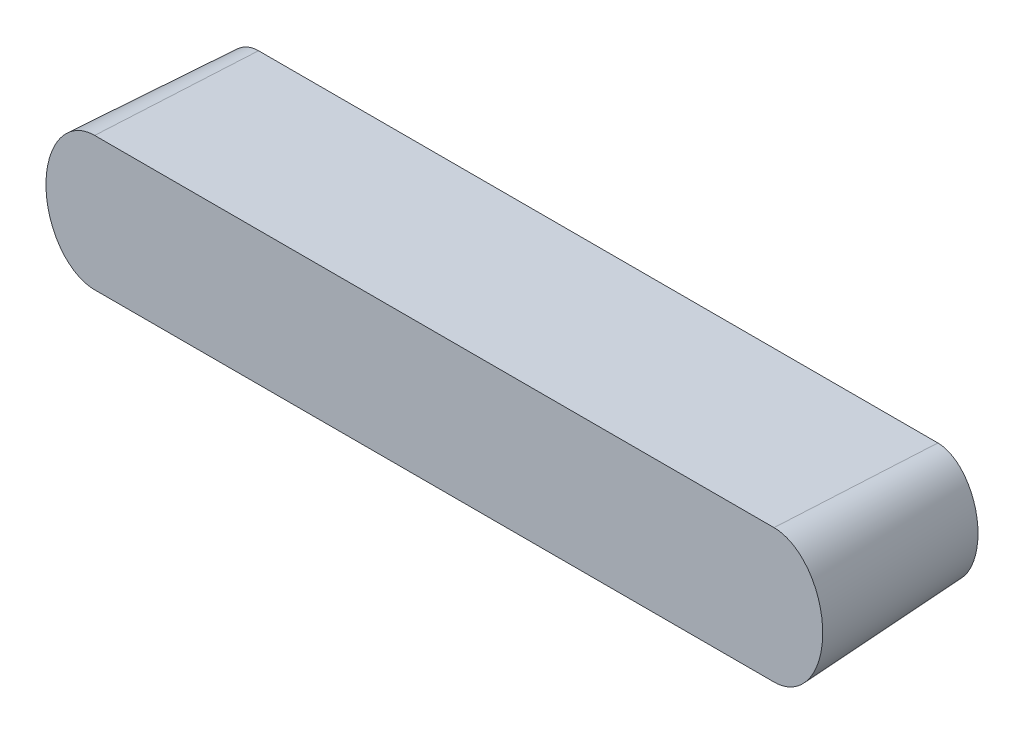
ISO-10303-21;
HEADER;
FILE_DESCRIPTION(('STEP AP214'),'2;1');
FILE_NAME('part.step','',(''),(''),'','','');
FILE_SCHEMA(('AUTOMOTIVE_DESIGN { 1 0 10303 214 1 1 1 1 }'));
ENDSEC;
DATA;
#1=APPLICATION_CONTEXT('core data for automotive mechanical design processes');
#2=APPLICATION_PROTOCOL_DEFINITION('international standard','automotive_design',2000,#1);
#3=PRODUCT_CONTEXT('',#1,'mechanical');
#4=PRODUCT('Part','Part','',(#3));
#5=PRODUCT_RELATED_PRODUCT_CATEGORY('part','',(#4));
#6=PRODUCT_DEFINITION_FORMATION('','',#4);
#7=PRODUCT_DEFINITION_CONTEXT('part definition',#1,'design');
#8=PRODUCT_DEFINITION('design','',#6,#7);
#9=PRODUCT_DEFINITION_SHAPE('','',#8);
#10=(LENGTH_UNIT() NAMED_UNIT(*) SI_UNIT(.MILLI.,.METRE.));
#11=(NAMED_UNIT(*) PLANE_ANGLE_UNIT() SI_UNIT($,.RADIAN.));
#12=(NAMED_UNIT(*) SI_UNIT($,.STERADIAN.) SOLID_ANGLE_UNIT());
#13=UNCERTAINTY_MEASURE_WITH_UNIT(LENGTH_MEASURE(1.E-05),#10,'distance_accuracy_value','');
#14=(GEOMETRIC_REPRESENTATION_CONTEXT(3) GLOBAL_UNCERTAINTY_ASSIGNED_CONTEXT((#13)) GLOBAL_UNIT_ASSIGNED_CONTEXT((#10,
#11,#12)) REPRESENTATION_CONTEXT('',''));
#15=CARTESIAN_POINT('',(0.,0.,0.));
#16=DIRECTION('',(0.,0.,1.));
#17=DIRECTION('',(1.,0.,0.));
#18=AXIS2_PLACEMENT_3D('',#15,#16,#17);
#19=CARTESIAN_POINT('',(0.,-15.1,0.));
#20=DIRECTION('',(0.,-0.998629534754574,-0.0523359562429439));
#21=DIRECTION('',(0.,0.0523359562429439,-0.998629534754574));
#22=AXIS2_PLACEMENT_3D('',#19,#20,#21);
#23=PLANE('',#22);
#24=DIRECTION('',(-1.,0.,0.));
#25=VECTOR('',#24,1.);
#26=CARTESIAN_POINT('',(0.,-15.1,0.));
#27=LINE('',#26,#25);
#28=CARTESIAN_POINT('',(76.7,-15.1,0.));
#29=VERTEX_POINT('',#28);
#30=CARTESIAN_POINT('',(-76.7,-15.1,0.));
#31=VERTEX_POINT('',#30);
#32=EDGE_CURVE('E106',#29,#31,#27,.T.);
#33=ORIENTED_EDGE('',*,*,#32,.T.);
#34=DIRECTION('',(-1.36167843581694E-13,-0.0523359562429439,0.998629534754574));
#35=VECTOR('',#34,1.);
#36=CARTESIAN_POINT('',(-76.7,-15.1,0.));
#37=LINE('',#36,#35);
#38=CARTESIAN_POINT('',(-76.6999999999949,-13.1609121665274,-37.));
#39=VERTEX_POINT('',#38);
#40=EDGE_CURVE('E11',#39,#31,#37,.T.);
#41=ORIENTED_EDGE('',*,*,#40,.F.);
#42=DIRECTION('',(1.,0.,0.));
#43=VECTOR('',#42,1.);
#44=CARTESIAN_POINT('',(0.,-13.1609121665275,-37.));
#45=LINE('',#44,#43);
#46=CARTESIAN_POINT('',(76.7,-13.1609121665275,-37.));
#47=VERTEX_POINT('',#46);
#48=EDGE_CURVE('E72',#47,#39,#45,.F.);
#49=ORIENTED_EDGE('',*,*,#48,.F.);
#50=DIRECTION('',(0.,-0.0523359562429439,0.998629534754574));
#51=VECTOR('',#50,1.);
#52=CARTESIAN_POINT('',(76.7,-15.1,0.));
#53=LINE('',#52,#51);
#54=EDGE_CURVE('E92',#47,#29,#53,.T.);
#55=ORIENTED_EDGE('',*,*,#54,.T.);
#56=EDGE_LOOP('',(#33,#41,#49,#55));
#57=FACE_BOUND('',#56,.T.);
#58=ADVANCED_FACE('F47',(#57),#23,.T.);
#59=CARTESIAN_POINT('',(-76.7,15.1,0.));
#60=CARTESIAN_POINT('',(-78.1401562411172,15.0999999999962,0.));
#61=CARTESIAN_POINT('',(-79.5792267295767,14.7069874167698,0.));
#62=CARTESIAN_POINT('',(-82.2398087824553,13.194174465071,0.));
#63=CARTESIAN_POINT('',(-83.4600139206978,12.0749693188768,0.));
#64=CARTESIAN_POINT('',(-85.4963352654062,9.2796554729569,0.));
#65=CARTESIAN_POINT('',(-86.3116502723299,7.60464660216702,0.));
#66=CARTESIAN_POINT('',(-87.4136994429184,3.95239305525867,0.));
#67=CARTESIAN_POINT('',(-87.7,1.97658537643877,0.));
#68=CARTESIAN_POINT('',(-87.7,-1.97658537643876,0.));
#69=CARTESIAN_POINT('',(-87.4136994429317,-3.95239305525785,0.));
#70=CARTESIAN_POINT('',(-86.3116502723166,-7.60464660216785,0.));
#71=CARTESIAN_POINT('',(-85.4963352654062,-9.2796554729554,0.));
#72=CARTESIAN_POINT('',(-83.4600139206978,-12.0749693188783,0.));
#73=CARTESIAN_POINT('',(-82.239808782457,-13.1941744650714,0.));
#74=CARTESIAN_POINT('',(-79.579226729575,-14.7069874167694,0.));
#75=CARTESIAN_POINT('',(-78.1401562411185,-15.0999999999962,0.));
#76=CARTESIAN_POINT('',(-76.7,-15.1,0.));
#77=CARTESIAN_POINT('',(-76.7,12.773094599833,-44.4));
#78=CARTESIAN_POINT('',(-77.7186303323347,12.7730945998255,-44.4));
#79=CARTESIAN_POINT('',(-78.7508657085418,12.5012362949952,-44.4));
#80=CARTESIAN_POINT('',(-80.7678578028915,11.3543700421512,-44.4));
#81=CARTESIAN_POINT('',(-81.7499469746874,10.4705336706187,-44.4));
#82=CARTESIAN_POINT('',(-83.4448531115476,8.14388979018459,-44.4));
#83=CARTESIAN_POINT('',(-84.1527814994153,6.70434447779965,-44.4));
#84=CARTESIAN_POINT('',(-85.1171714026316,3.50830156084452,-44.4));
#85=CARTESIAN_POINT('',(-85.373094599833,1.75469774387151,-44.4));
#86=CARTESIAN_POINT('',(-85.373094599833,-1.7546977438715,-44.4));
#87=CARTESIAN_POINT('',(-85.1171714026448,-3.5083015608437,-44.4));
#88=CARTESIAN_POINT('',(-84.152781499402,-6.70434447780048,-44.4));
#89=CARTESIAN_POINT('',(-83.4448531115476,-8.14388979018308,-44.4));
#90=CARTESIAN_POINT('',(-81.7499469746874,-10.4705336706202,-44.4));
#91=CARTESIAN_POINT('',(-80.7678578028822,-11.3543700421518,-44.4));
#92=CARTESIAN_POINT('',(-78.7508657085511,-12.5012362949946,-44.4));
#93=CARTESIAN_POINT('',(-77.7186303323277,-12.7730945998255,-44.4));
#94=CARTESIAN_POINT('',(-76.7,-12.7730945998329,-44.4));
#95=B_SPLINE_SURFACE_WITH_KNOTS('',1,3,((#59,#60,#61,#62,#63,#64,#65,#66,#67,#68,#69,#70,#71,
#72,#73,#74,#75,#76),(#77,#78,#79,#80,#81,#82,#83,#84,#85,#86,#87,#88,#89,#90,#91,#92,#93,#94)),
.UNSPECIFIED.,.F.,.F.,.F.,(2,2),(4,2,2,2,2,2,2,2,4),(0.,1.),(0.,0.392699081698724,
0.785398163397448,1.17809724509617,1.5707963267949,1.96349540849362,2.35619449019234,
2.74889357189107,3.14159265358979),.UNSPECIFIED.);
#96=CARTESIAN_POINT('',(-76.7,15.1,0.));
#97=CARTESIAN_POINT('',(-76.8392444738131,15.1000024307595,0.));
#98=CARTESIAN_POINT('',(-76.9784607489228,15.0963248963539,0.));
#99=CARTESIAN_POINT('',(-77.2564980105823,15.0816977278739,0.));
#100=CARTESIAN_POINT('',(-77.3953190336352,15.0707487887659,0.));
#101=CARTESIAN_POINT('',(-77.8103875266034,15.027160531762,0.));
#102=CARTESIAN_POINT('',(-78.0855772376846,14.9837793380328,0.));
#103=CARTESIAN_POINT('',(-78.6273363493884,14.8701992715203,0.));
#104=CARTESIAN_POINT('',(-78.893965091248,14.8002788658976,0.));
#105=CARTESIAN_POINT('',(-79.4192943901191,14.6351764138245,0.));
#106=CARTESIAN_POINT('',(-79.6779943955578,14.5399926143234,0.));
#107=CARTESIAN_POINT('',(-80.1462703289712,14.342746800664,0.));
#108=CARTESIAN_POINT('',(-80.3572615282197,14.244018548094,0.));
#109=CARTESIAN_POINT('',(-80.7711452931723,14.0310324420212,0.));
#110=CARTESIAN_POINT('',(-80.9740395721764,13.9167778966483,0.));
#111=CARTESIAN_POINT('',(-81.5703289949608,13.5522511000801,0.));
#112=CARTESIAN_POINT('',(-81.9507820794239,13.2804515711089,0.));
#113=CARTESIAN_POINT('',(-82.5815763140169,12.7663863786033,0.));
#114=CARTESIAN_POINT('',(-82.8403766648996,12.5342298258933,0.));
#115=CARTESIAN_POINT('',(-83.3368503589051,12.0481529505582,0.));
#116=CARTESIAN_POINT('',(-83.5745170290508,11.79422580321,0.));
#117=CARTESIAN_POINT('',(-84.0288213505259,11.2675290066093,0.));
#118=CARTESIAN_POINT('',(-84.2454219189834,10.9947275269127,0.));
#119=CARTESIAN_POINT('',(-84.6571641440013,10.4334420345669,0.));
#120=CARTESIAN_POINT('',(-84.8523049470044,10.1449573988051,0.));
#121=CARTESIAN_POINT('',(-85.286380499131,9.45197108258819,0.));
#122=CARTESIAN_POINT('',(-85.5168133360782,9.04213347857937,0.));
#123=CARTESIAN_POINT('',(-85.9414435954454,8.20407801193669,0.));
#124=CARTESIAN_POINT('',(-86.1356284070178,7.77585381602134,0.));
#125=CARTESIAN_POINT('',(-86.4889113076801,6.90502290006705,0.));
#126=CARTESIAN_POINT('',(-86.64799608004,6.46241079416522,0.));
#127=CARTESIAN_POINT('',(-86.9315504432145,5.56633738888973,0.));
#128=CARTESIAN_POINT('',(-87.0560234937032,5.11287717878144,0.));
#129=CARTESIAN_POINT('',(-87.2739282370787,4.18853326893497,0.));
#130=CARTESIAN_POINT('',(-87.3666528770068,3.71748366494606,0.));
#131=CARTESIAN_POINT('',(-87.5183768145787,2.77000982461171,0.));
#132=CARTESIAN_POINT('',(-87.5773751404008,2.29358543379545,0.));
#133=CARTESIAN_POINT('',(-87.6620399245951,1.33746362037962,0.));
#134=CARTESIAN_POINT('',(-87.6876868141429,0.857764442078052,0.));
#135=CARTESIAN_POINT('',(-87.7009337978687,0.137819964702817,0.));
#136=CARTESIAN_POINT('',(-87.7011443345424,-0.102251355016315,0.));
#137=CARTESIAN_POINT('',(-87.6931401009297,-0.582256733572873,0.));
#138=CARTESIAN_POINT('',(-87.6849250966077,-0.822190788412271,0.));
#139=CARTESIAN_POINT('',(-87.6429687983077,-1.63366470742784,0.));
#140=CARTESIAN_POINT('',(-87.5896324853747,-2.20431103678944,0.));
#141=CARTESIAN_POINT('',(-87.435169783736,-3.33929163993242,0.));
#142=CARTESIAN_POINT('',(-87.334031208996,-3.90362426661402,0.));
#143=CARTESIAN_POINT('',(-87.1455252233669,-4.74153456654375,0.));
#144=CARTESIAN_POINT('',(-87.0765766453844,-5.01934463684308,0.));
#145=CARTESIAN_POINT('',(-86.9260736126981,-5.57155969823485,0.));
#146=CARTESIAN_POINT('',(-86.8445189060988,-5.84596462116729,0.));
#147=CARTESIAN_POINT('',(-86.6685992676085,-6.39051431814964,0.));
#148=CARTESIAN_POINT('',(-86.5742397206635,-6.66066083001091,0.));
#149=CARTESIAN_POINT('',(-86.3725838012229,-7.1960507213937,0.));
#150=CARTESIAN_POINT('',(-86.2652885629976,-7.46129452846163,0.));
#151=CARTESIAN_POINT('',(-85.9971648822763,-8.0791288712665,0.));
#152=CARTESIAN_POINT('',(-85.8308411403944,-8.42935770764196,0.));
#153=CARTESIAN_POINT('',(-85.4734032734727,-9.11693182516354,0.));
#154=CARTESIAN_POINT('',(-85.2822908980812,-9.45427801342831,0.));
#155=CARTESIAN_POINT('',(-84.8746357492565,-10.11274898169,0.));
#156=CARTESIAN_POINT('',(-84.658124172163,-10.4338929823827,0.));
#157=CARTESIAN_POINT('',(-84.1985913214698,-11.0566206820528,0.));
#158=CARTESIAN_POINT('',(-83.9555772783707,-11.358209680472,0.));
#159=CARTESIAN_POINT('',(-83.5029065262132,-11.87027874714,0.));
#160=CARTESIAN_POINT('',(-83.2987041712001,-12.0855933991682,0.));
#161=CARTESIAN_POINT('',(-82.8747884134033,-12.5004447714639,0.));
#162=CARTESIAN_POINT('',(-82.6550751506638,-12.6999816341507,0.));
#163=CARTESIAN_POINT('',(-82.2006160339412,-13.0807194204424,0.));
#164=CARTESIAN_POINT('',(-81.9658849424788,-13.2619379121824,0.));
#165=CARTESIAN_POINT('',(-81.4816309938975,-13.6036222748252,0.));
#166=CARTESIAN_POINT('',(-81.2321060097589,-13.7640851509464,0.));
#167=CARTESIAN_POINT('',(-80.7637478952841,-14.0353623193046,0.));
#168=CARTESIAN_POINT('',(-80.547103653202,-14.1499600597068,0.));
#169=CARTESIAN_POINT('',(-80.1054184012756,-14.3613837613487,0.));
#170=CARTESIAN_POINT('',(-79.8803818281194,-14.4582189570601,0.));
#171=CARTESIAN_POINT('',(-79.4233198161318,-14.6327226133424,0.));
#172=CARTESIAN_POINT('',(-79.191304193576,-14.7104167007842,0.));
#173=CARTESIAN_POINT('',(-78.7215337530686,-14.8455360070161,0.));
#174=CARTESIAN_POINT('',(-78.4837811326846,-14.9029688592533,0.));
#175=CARTESIAN_POINT('',(-77.9897965431817,-14.9993161471361,0.));
#176=CARTESIAN_POINT('',(-77.7333057508882,-15.0369280143348,0.));
#177=CARTESIAN_POINT('',(-77.3467979846404,-15.0746869614312,0.));
#178=CARTESIAN_POINT('',(-77.2176332979765,-15.0841635035975,0.));
#179=CARTESIAN_POINT('',(-76.9589868131488,-15.0968211074637,0.));
#180=CARTESIAN_POINT('',(-76.8295049925089,-15.1000017092215,0.));
#181=CARTESIAN_POINT('',(-76.7,-15.1,0.));
#182=B_SPLINE_CURVE_WITH_KNOTS('',3,(#96,#97,#98,#99,#100,#101,#102,#103,#104,#105,#106,#107,
#108,#109,#110,#111,#112,#113,#114,#115,#116,#117,#118,#119,#120,#121,#122,#123,#124,#125,#126,
#127,#128,#129,#130,#131,#132,#133,#134,#135,#136,#137,#138,#139,#140,#141,#142,#143,#144,#145,
#146,#147,#148,#149,#150,#151,#152,#153,#154,#155,#156,#157,#158,#159,#160,#161,#162,#163,#164,
#165,#166,#167,#168,#169,#170,#171,#172,#173,#174,#175,#176,#177,#178,#179,#180,#181),
.UNSPECIFIED.,.F.,.F.,(4,2,2,2,2,2,2,2,2,2,2,2,2,2,2,2,2,2,2,2,2,2,2,2,2,2,2,2,2,2,2,2,2,2,2,2,
2,2,2,2,2,2,4),(0.,0.417630623772935,0.835221338128497,1.66939725884657,2.49505213560745,
3.32076432032262,4.01892635559848,4.71693986861422,6.11474147964152,7.1565335072338,
8.19865332204466,9.24257559192712,10.2865393685816,11.6950458571284,13.1040414616907,
14.5135707144477,15.9229590246011,17.3619558293485,18.8009940966104,20.240876333515,
20.9609605760445,21.68106482084,23.398340592288,25.116054378116,25.9745226561077,
26.8330080902176,27.6911336093695,28.5491839381595,29.7113522575259,30.8734385925257,
32.0341122619745,33.1944700605954,34.0839767362719,34.9734753818395,35.8621126994995,
36.7508780939738,37.4854003817469,38.2195397137193,38.9526907433546,39.68556526164,
40.4619705228036,40.85037331236,41.238804475158),.UNSPECIFIED.);
#183=CARTESIAN_POINT('',(-76.7,15.1,0.));
#184=VERTEX_POINT('',#183);
#185=EDGE_CURVE('E114',#184,#31,#182,.T.);
#186=DIRECTION('',(0.,0.0523359562429439,0.998629534754574));
#187=VECTOR('',#186,1.);
#188=CARTESIAN_POINT('',(-76.7,15.1,0.));
#189=LINE('',#188,#187);
#190=CARTESIAN_POINT('',(-76.7,13.1609121665275,-37.));
#191=VERTEX_POINT('',#190);
#192=EDGE_CURVE('E63',#191,#184,#189,.T.);
#193=CARTESIAN_POINT('',(-76.7,13.1609121665275,-37.));
#194=CARTESIAN_POINT('',(-76.7922553460365,13.160914118886,-37.));
#195=CARTESIAN_POINT('',(-76.8844976402715,13.1588151317916,-37.));
#196=CARTESIAN_POINT('',(-77.068788029735,13.1504369358659,-37.));
#197=CARTESIAN_POINT('',(-77.1608361337341,13.1441579200623,-37.));
#198=CARTESIAN_POINT('',(-77.4362628801368,13.1191000284494,-37.));
#199=CARTESIAN_POINT('',(-77.6191123450353,13.0941002160642,-37.));
#200=CARTESIAN_POINT('',(-77.9803400963526,13.0283142371389,-37.));
#201=CARTESIAN_POINT('',(-78.1587428758395,12.9876605806704,-37.));
#202=CARTESIAN_POINT('',(-78.511481062165,12.8913759343849,-37.));
#203=CARTESIAN_POINT('',(-78.6858158216275,12.835742578157,-37.));
#204=CARTESIAN_POINT('',(-79.0288811899904,12.7107330036221,-37.));
#205=CARTESIAN_POINT('',(-79.1976266603616,12.6413973391356,-37.));
#206=CARTESIAN_POINT('',(-79.5293134318555,12.490041280578,-37.));
#207=CARTESIAN_POINT('',(-79.6922550357198,12.4080215493294,-37.));
#208=CARTESIAN_POINT('',(-79.932077597324,12.2763149134518,-37.));
#209=CARTESIAN_POINT('',(-80.0113434175398,12.2309083693009,-37.));
#210=CARTESIAN_POINT('',(-80.1682057985692,12.1372971255671,-37.));
#211=CARTESIAN_POINT('',(-80.245802386381,12.0890924712877,-37.));
#212=CARTESIAN_POINT('',(-80.4760645198506,11.9405416426564,-37.));
#213=CARTESIAN_POINT('',(-80.6262015873268,11.8362590711423,-37.));
#214=CARTESIAN_POINT('',(-80.9963159528814,11.5613751721621,-37.));
#215=CARTESIAN_POINT('',(-81.2117353612856,11.3846220196321,-37.));
#216=CARTESIAN_POINT('',(-81.6263451504917,11.0129787825361,-37.));
#217=CARTESIAN_POINT('',(-81.8255284990837,10.8180809165444,-37.));
#218=CARTESIAN_POINT('',(-82.2079427689798,10.4126728450204,-37.));
#219=CARTESIAN_POINT('',(-82.3911472226855,10.2021377670025,-37.));
#220=CARTESIAN_POINT('',(-82.7413559903389,9.76804790245519,-37.));
#221=CARTESIAN_POINT('',(-82.9083610465218,9.54449371319649,-37.));
#222=CARTESIAN_POINT('',(-83.1799048812119,9.15339779960635,-37.));
#223=CARTESIAN_POINT('',(-83.2884272245632,8.98859781575885,-37.));
#224=CARTESIAN_POINT('',(-83.4978121698747,8.65419171500724,-37.));
#225=CARTESIAN_POINT('',(-83.5986740084567,8.48458512142523,-37.));
#226=CARTESIAN_POINT('',(-83.8901557931143,7.96935209379995,-37.));
#227=CARTESIAN_POINT('',(-84.0696335474832,7.61736847310544,-37.));
#228=CARTESIAN_POINT('',(-84.4003035673981,6.90002787910232,-37.));
#229=CARTESIAN_POINT('',(-84.5514677405801,6.53465804929923,-37.));
#230=CARTESIAN_POINT('',(-84.7574209598227,5.97901608506859,-37.));
#231=CARTESIAN_POINT('',(-84.8226078389311,5.79253300126309,-37.));
#232=CARTESIAN_POINT('',(-84.9461037712026,5.41729275143551,-37.));
#233=CARTESIAN_POINT('',(-85.0044126599775,5.22853553117905,-37.));
#234=CARTESIAN_POINT('',(-85.1300112976429,4.79457371640463,-37.));
#235=CARTESIAN_POINT('',(-85.1950732978379,4.548721578644,-37.));
#236=CARTESIAN_POINT('',(-85.3143285208673,4.05441187507838,-37.));
#237=CARTESIAN_POINT('',(-85.3685210047928,3.80595413335193,-37.));
#238=CARTESIAN_POINT('',(-85.515228856691,3.05730259077124,-37.));
#239=CARTESIAN_POINT('',(-85.5918624478251,2.55387308707117,-37.));
#240=CARTESIAN_POINT('',(-85.675780483198,1.79526963603962,-37.));
#241=CARTESIAN_POINT('',(-85.6985855447666,1.54166887351895,-37.));
#242=CARTESIAN_POINT('',(-85.7338259712934,1.0337235817248,-37.));
#243=CARTESIAN_POINT('',(-85.7462613823678,0.779379055764048,-37.));
#244=CARTESIAN_POINT('',(-85.7606719749726,0.270438684026884,-37.));
#245=CARTESIAN_POINT('',(-85.7626487968069,0.0158428839249036,-37.));
#246=CARTESIAN_POINT('',(-85.7560921334353,-0.493213319177322,-37.));
#247=CARTESIAN_POINT('',(-85.747558610764,-0.74767372169169,-37.));
#248=CARTESIAN_POINT('',(-85.7200290092256,-1.25755903493955,-37.));
#249=CARTESIAN_POINT('',(-85.7009707118133,-1.51298062232545,-37.));
#250=CARTESIAN_POINT('',(-85.6523623356032,-2.02279956047374,-37.));
#251=CARTESIAN_POINT('',(-85.6228121725316,-2.27719690299249,-37.));
#252=CARTESIAN_POINT('',(-85.5183347852744,-3.03836205682426,-37.));
#253=CARTESIAN_POINT('',(-85.4275801718805,-3.5431121724076,-37.));
#254=CARTESIAN_POINT('',(-85.2588569416956,-4.29229962648786,-37.));
#255=CARTESIAN_POINT('',(-85.1972358997094,-4.54054295487452,-37.));
#256=CARTESIAN_POINT('',(-85.0627379452737,-5.03399809646916,-37.));
#257=CARTESIAN_POINT('',(-84.9898608431791,-5.27920985852528,-37.));
#258=CARTESIAN_POINT('',(-84.8326095128628,-5.76579561354953,-37.));
#259=CARTESIAN_POINT('',(-84.7482405884954,-6.00717131992826,-37.));
#260=CARTESIAN_POINT('',(-84.5679056770117,-6.48552417206059,-37.));
#261=CARTESIAN_POINT('',(-84.4719407870715,-6.72250173151019,-37.));
#262=CARTESIAN_POINT('',(-84.2393628765739,-7.25767144501967,-37.));
#263=CARTESIAN_POINT('',(-84.0989303911266,-7.55421751265586,-37.));
#264=CARTESIAN_POINT('',(-83.7979791272382,-8.13694836161684,-37.));
#265=CARTESIAN_POINT('',(-83.6374614533058,-8.42313371157506,-37.));
#266=CARTESIAN_POINT('',(-83.2955570461099,-8.98241481095335,-37.));
#267=CARTESIAN_POINT('',(-83.1141922631274,-9.25552390694008,-37.));
#268=CARTESIAN_POINT('',(-82.7293103688212,-9.78565515933269,-37.));
#269=CARTESIAN_POINT('',(-82.5258003163942,-10.0426824009917,-37.));
#270=CARTESIAN_POINT('',(-82.1517700924863,-10.4735430628303,-37.));
#271=CARTESIAN_POINT('',(-81.9862665081878,-10.6517443946115,-37.));
#272=CARTESIAN_POINT('',(-81.6428243773547,-10.9958077859144,-37.));
#273=CARTESIAN_POINT('',(-81.4648855314233,-11.1616695481447,-37.));
#274=CARTESIAN_POINT('',(-81.0967593696075,-11.4789202694337,-37.));
#275=CARTESIAN_POINT('',(-80.9065822992422,-11.6303210776524,-37.));
#276=CARTESIAN_POINT('',(-80.5140334861022,-11.9163932253094,-37.));
#277=CARTESIAN_POINT('',(-80.3116657274999,-12.0510699869357,-37.));
#278=CARTESIAN_POINT('',(-79.9400850915271,-12.2738796988041,-37.));
#279=CARTESIAN_POINT('',(-79.7731315057745,-12.3657871064247,-37.));
#280=CARTESIAN_POINT('',(-79.4325986906938,-12.536451164738,-37.));
#281=CARTESIAN_POINT('',(-79.2590193472478,-12.6152075888004,-37.));
#282=CARTESIAN_POINT('',(-78.9062956029422,-12.7579925903603,-37.));
#283=CARTESIAN_POINT('',(-78.727163567403,-12.8220515504177,-37.));
#284=CARTESIAN_POINT('',(-78.3640918746191,-12.9343966688983,-37.));
#285=CARTESIAN_POINT('',(-78.1801540848259,-12.9826888584487,-37.));
#286=CARTESIAN_POINT('',(-77.782028797567,-13.0682009105253,-37.));
#287=CARTESIAN_POINT('',(-77.5672754994098,-13.1028515026866,-37.));
#288=CARTESIAN_POINT('',(-77.2432270288433,-13.1376247251207,-37.));
#289=CARTESIAN_POINT('',(-77.1347917091643,-13.1463487712668,-37.));
#290=CARTESIAN_POINT('',(-76.9175786159121,-13.1579950818237,-37.));
#291=CARTESIAN_POINT('',(-76.8088007520546,-13.1609156610709,-37.));
#292=CARTESIAN_POINT('',(-76.7,-13.1609121665274,-37.));
#293=B_SPLINE_CURVE_WITH_KNOTS('',3,(#193,#194,#195,#196,#197,#198,#199,#200,#201,#202,#203,
#204,#205,#206,#207,#208,#209,#210,#211,#212,#213,#214,#215,#216,#217,#218,#219,#220,#221,#222,
#223,#224,#225,#226,#227,#228,#229,#230,#231,#232,#233,#234,#235,#236,#237,#238,#239,#240,#241,
#242,#243,#244,#245,#246,#247,#248,#249,#250,#251,#252,#253,#254,#255,#256,#257,#258,#259,#260,
#261,#262,#263,#264,#265,#266,#267,#268,#269,#270,#271,#272,#273,#274,#275,#276,#277,#278,#279,
#280,#281,#282,#283,#284,#285,#286,#287,#288,#289,#290,#291,#292),.UNSPECIFIED.,.F.,.F.,(4,2,2,
2,2,2,2,2,2,2,2,2,2,2,2,2,2,2,2,2,2,2,2,2,2,2,2,2,2,2,2,2,2,2,2,2,2,2,2,2,2,2,2,2,2,2,2,2,2,4),
(0.,0.276716374545906,0.55341997160431,1.10626410042643,1.65452777539986,2.20287811293425,
2.74962920434888,3.29635173421903,3.57035418470428,3.84435220013007,4.39235113156624,
5.22706336589636,6.06213523318162,6.89856504481232,7.7349565141914,8.32671546726725,
8.91853331266197,10.1023722323664,11.2873795905326,11.8799116650725,12.4724578986068,
13.235123218887,13.9978403675472,15.5234072091441,16.287126884001,17.050843162411,
17.8144396575681,18.5780388746773,19.346201291675,20.1143698789258,21.6506795579835,
22.4178121516505,23.1849576715906,23.9517503208134,24.7184704750882,25.7020727156877,
26.6856208905683,27.6681427964257,28.6503524316976,29.3794040078112,30.1084731429312,
30.8369396670451,31.5651693912516,32.136382684416,32.7076058202532,33.2776372667143,
33.8474504077714,34.4987101993394,34.8249335079783,35.1512515288609),.UNSPECIFIED.);
#294=EDGE_CURVE('E108',#191,#39,#293,.T.);
#295=ORIENTED_EDGE('',*,*,#185,.F.);
#296=ORIENTED_EDGE('',*,*,#192,.F.);
#297=ORIENTED_EDGE('',*,*,#294,.T.);
#298=ORIENTED_EDGE('',*,*,#40,.T.);
#299=EDGE_LOOP('',(#295,#296,#297,#298));
#300=FACE_BOUND('',#299,.T.);
#301=ADVANCED_FACE('F140',(#300),#95,.T.);
#302=CARTESIAN_POINT('',(0.,15.1,0.));
#303=DIRECTION('',(0.,0.998629534754574,-0.0523359562429439));
#304=DIRECTION('',(0.,0.0523359562429439,0.998629534754574));
#305=AXIS2_PLACEMENT_3D('',#302,#303,#304);
#306=PLANE('',#305);
#307=DIRECTION('',(-1.,0.,0.));
#308=VECTOR('',#307,1.);
#309=CARTESIAN_POINT('',(0.,15.1,0.));
#310=LINE('',#309,#308);
#311=CARTESIAN_POINT('',(76.7,15.1,0.));
#312=VERTEX_POINT('',#311);
#313=EDGE_CURVE('E117',#312,#184,#310,.T.);
#314=ORIENTED_EDGE('',*,*,#313,.F.);
#315=DIRECTION('',(1.36167843581697E-13,0.0523359562429438,0.998629534754574));
#316=VECTOR('',#315,1.);
#317=CARTESIAN_POINT('',(76.7,15.1,0.));
#318=LINE('',#317,#316);
#319=CARTESIAN_POINT('',(76.699999999995,13.1609121665275,-37.));
#320=VERTEX_POINT('',#319);
#321=EDGE_CURVE('E85',#320,#312,#318,.T.);
#322=ORIENTED_EDGE('',*,*,#321,.F.);
#323=DIRECTION('',(-1.,0.,0.));
#324=VECTOR('',#323,1.);
#325=CARTESIAN_POINT('',(0.,13.1609121665275,-37.));
#326=LINE('',#325,#324);
#327=EDGE_CURVE('E162',#320,#191,#326,.T.);
#328=ORIENTED_EDGE('',*,*,#327,.T.);
#329=ORIENTED_EDGE('',*,*,#192,.T.);
#330=EDGE_LOOP('',(#314,#322,#328,#329));
#331=FACE_BOUND('',#330,.T.);
#332=ADVANCED_FACE('F49',(#331),#306,.T.);
#333=CARTESIAN_POINT('',(76.7,-15.1,0.));
#334=CARTESIAN_POINT('',(78.1401562411173,-15.0999999999962,0.));
#335=CARTESIAN_POINT('',(79.5792267295767,-14.7069874167711,0.));
#336=CARTESIAN_POINT('',(82.2398087824553,-13.1941744650697,0.));
#337=CARTESIAN_POINT('',(83.4600139206978,-12.0749693188783,0.));
#338=CARTESIAN_POINT('',(85.4963352654063,-9.27965547295541,0.));
#339=CARTESIAN_POINT('',(86.3116502723299,-7.60464660216702,0.));
#340=CARTESIAN_POINT('',(87.4136994429185,-3.95239305525867,0.));
#341=CARTESIAN_POINT('',(87.7,-1.97658537643877,0.));
#342=CARTESIAN_POINT('',(87.7,1.97658537643877,0.));
#343=CARTESIAN_POINT('',(87.4136994429185,3.95239305525786,0.));
#344=CARTESIAN_POINT('',(86.3116502723299,7.60464660216786,0.));
#345=CARTESIAN_POINT('',(85.4963352654063,9.27965547295542,0.));
#346=CARTESIAN_POINT('',(83.4600139206978,12.0749693188783,0.));
#347=CARTESIAN_POINT('',(82.239808782457,13.1941744650714,0.));
#348=CARTESIAN_POINT('',(79.579226729575,14.7069874167695,0.));
#349=CARTESIAN_POINT('',(78.1401562411185,15.0999999999963,0.));
#350=CARTESIAN_POINT('',(76.7,15.1,0.));
#351=CARTESIAN_POINT('',(76.7,-12.773094599833,-44.4));
#352=CARTESIAN_POINT('',(77.7186303323268,-12.7730945998305,-44.4));
#353=CARTESIAN_POINT('',(78.7508657085524,-12.5012362949979,-44.4));
#354=CARTESIAN_POINT('',(80.7678578028809,-11.3543700421486,-44.4));
#355=CARTESIAN_POINT('',(81.7499469746874,-10.4705336706187,-44.4));
#356=CARTESIAN_POINT('',(83.4448531115476,-8.1438897901846,-44.4));
#357=CARTESIAN_POINT('',(84.1527814994153,-6.70434447779965,-44.4));
#358=CARTESIAN_POINT('',(85.1171714026316,-3.50830156084453,-44.4));
#359=CARTESIAN_POINT('',(85.373094599833,-1.75469774387151,-44.4));
#360=CARTESIAN_POINT('',(85.373094599833,1.75469774387151,-44.4));
#361=CARTESIAN_POINT('',(85.1171714026316,3.50830156084289,-44.4));
#362=CARTESIAN_POINT('',(84.1527814994153,6.70434447780132,-44.4));
#363=CARTESIAN_POINT('',(83.4448531115476,8.14388979018461,-44.4));
#364=CARTESIAN_POINT('',(81.7499469746874,10.4705336706188,-44.4));
#365=CARTESIAN_POINT('',(80.7678578028822,11.3543700421518,-44.4));
#366=CARTESIAN_POINT('',(78.7508657085511,12.5012362949946,-44.4));
#367=CARTESIAN_POINT('',(77.7186303323278,12.7730945998305,-44.4));
#368=CARTESIAN_POINT('',(76.7,12.773094599833,-44.4));
#369=B_SPLINE_SURFACE_WITH_KNOTS('',1,3,((#333,#334,#335,#336,#337,#338,#339,#340,#341,#342,
#343,#344,#345,#346,#347,#348,#349,#350),(#351,#352,#353,#354,#355,#356,#357,#358,#359,#360,
#361,#362,#363,#364,#365,#366,#367,#368)),.UNSPECIFIED.,.F.,.F.,.F.,(2,2),(4,2,2,2,2,2,2,2,4),
(0.,1.),(0.,0.392699081698724,0.785398163397448,1.17809724509617,1.5707963267949,
1.96349540849362,2.35619449019234,2.74889357189107,3.14159265358979),.UNSPECIFIED.);
#370=CARTESIAN_POINT('',(76.7,-15.1,0.));
#371=CARTESIAN_POINT('',(76.8392444738096,-15.1000024307596,0.));
#372=CARTESIAN_POINT('',(76.9784607489159,-15.0963248963541,0.));
#373=CARTESIAN_POINT('',(77.2564980105684,-15.0816977278749,0.));
#374=CARTESIAN_POINT('',(77.3953190336178,-15.0707487887675,0.));
#375=CARTESIAN_POINT('',(77.8103875265758,-15.0271605317658,0.));
#376=CARTESIAN_POINT('',(78.0855772376503,-14.9837793380388,0.));
#377=CARTESIAN_POINT('',(78.6273363493413,-14.870199271532,0.));
#378=CARTESIAN_POINT('',(78.8939650911949,-14.8002788659128,0.));
#379=CARTESIAN_POINT('',(79.4192943900543,-14.6351764138476,0.));
#380=CARTESIAN_POINT('',(79.6779943954875,-14.5399926143509,0.));
#381=CARTESIAN_POINT('',(80.1462703288961,-14.3427468006985,0.));
#382=CARTESIAN_POINT('',(80.357261528145,-14.2440185481306,0.));
#383=CARTESIAN_POINT('',(80.7711452930986,-14.0310324420617,0.));
#384=CARTESIAN_POINT('',(80.9740395721032,-13.9167778966906,0.));
#385=CARTESIAN_POINT('',(81.5703289948895,-13.5522511001281,0.));
#386=CARTESIAN_POINT('',(81.9507820793541,-13.2804515711607,0.));
#387=CARTESIAN_POINT('',(82.5815763139481,-12.766386378663,0.));
#388=CARTESIAN_POINT('',(82.8403766648303,-12.5342298259573,0.));
#389=CARTESIAN_POINT('',(83.3368503588352,-12.048152950631,0.));
#390=CARTESIAN_POINT('',(83.5745170289808,-11.7942258032872,0.));
#391=CARTESIAN_POINT('',(84.028821350456,-11.2675290066953,0.));
#392=CARTESIAN_POINT('',(84.2454219189136,-10.9947275270031,0.));
#393=CARTESIAN_POINT('',(84.6571641439322,-10.4334420346659,0.));
#394=CARTESIAN_POINT('',(84.8523049469358,-10.1449573989085,0.));
#395=CARTESIAN_POINT('',(85.2863804990649,-9.45197108270061,0.));
#396=CARTESIAN_POINT('',(85.5168133360142,-9.04213347869641,0.));
#397=CARTESIAN_POINT('',(85.9414435953857,-8.20407801206274,0.));
#398=CARTESIAN_POINT('',(86.1356284069605,-7.77585381615181,0.));
#399=CARTESIAN_POINT('',(86.4889113076279,-6.90502290020615,0.));
#400=CARTESIAN_POINT('',(86.6479960799905,-6.46241079430854,0.));
#401=CARTESIAN_POINT('',(86.9315504431707,-5.56633738904128,0.));
#402=CARTESIAN_POINT('',(87.0560234936625,-5.112877178937,0.));
#403=CARTESIAN_POINT('',(87.2739282370444,-4.18853326909846,0.));
#404=CARTESIAN_POINT('',(87.3666528769758,-3.71748366511346,0.));
#405=CARTESIAN_POINT('',(87.5183768145549,-2.77000982478667,0.));
#406=CARTESIAN_POINT('',(87.5773751403808,-2.29358543397404,0.));
#407=CARTESIAN_POINT('',(87.6620399245829,-1.33746362056515,0.));
#408=CARTESIAN_POINT('',(87.6876868141349,-0.857764442266877,0.));
#409=CARTESIAN_POINT('',(87.7009337978674,-0.13781996489639,0.));
#410=CARTESIAN_POINT('',(87.7011443345434,0.10225135482117,0.));
#411=CARTESIAN_POINT('',(87.6931401009351,0.582256733374656,0.));
#412=CARTESIAN_POINT('',(87.6849250966151,0.822190788212554,0.));
#413=CARTESIAN_POINT('',(87.6429687983218,1.63366470722157,0.));
#414=CARTESIAN_POINT('',(87.5896324853937,2.20431103657826,0.));
#415=CARTESIAN_POINT('',(87.4351697837665,3.33929163971227,0.));
#416=CARTESIAN_POINT('',(87.3340312090331,3.9036242663898,0.));
#417=CARTESIAN_POINT('',(87.145525223417,4.74153456631454,0.));
#418=CARTESIAN_POINT('',(87.0765766454392,5.01934463661238,0.));
#419=CARTESIAN_POINT('',(86.9260736127639,5.57155969800182,0.));
#420=CARTESIAN_POINT('',(86.844518906171,5.84596462093342,0.));
#421=CARTESIAN_POINT('',(86.6685992676925,6.39051431791401,0.));
#422=CARTESIAN_POINT('',(86.5742397207529,6.66066082977435,0.));
#423=CARTESIAN_POINT('',(86.3725838013228,7.19605072115537,0.));
#424=CARTESIAN_POINT('',(86.2652885631026,7.46129452822245,0.));
#425=CARTESIAN_POINT('',(85.997164882389,8.0791288710347,0.));
#426=CARTESIAN_POINT('',(85.8308411405091,8.42935770741818,0.));
#427=CARTESIAN_POINT('',(85.4734032735904,9.11693182495584,0.));
#428=CARTESIAN_POINT('',(85.2822908982,9.45427801322868,0.));
#429=CARTESIAN_POINT('',(84.8746357493772,10.112748981507,0.));
#430=CARTESIAN_POINT('',(84.6581241722847,10.4338929822082,0.));
#431=CARTESIAN_POINT('',(84.1985913215929,11.0566206818956,0.));
#432=CARTESIAN_POINT('',(83.9555772784943,11.3582096803235,0.));
#433=CARTESIAN_POINT('',(83.502906526338,11.8702787470055,0.));
#434=CARTESIAN_POINT('',(83.2987041713258,12.085593399039,0.));
#435=CARTESIAN_POINT('',(82.8747884135306,12.5004447713455,0.));
#436=CARTESIAN_POINT('',(82.6550751507917,12.6999816340378,0.));
#437=CARTESIAN_POINT('',(82.20061603407,13.0807194203404,0.));
#438=CARTESIAN_POINT('',(81.9658849426078,13.2619379120859,0.));
#439=CARTESIAN_POINT('',(81.4816309940266,13.6036222747397,0.));
#440=CARTESIAN_POINT('',(81.2321060098877,13.7640851508664,0.));
#441=CARTESIAN_POINT('',(80.7637478954132,14.0353623192342,0.));
#442=CARTESIAN_POINT('',(80.5471036533315,14.1499600596405,0.));
#443=CARTESIAN_POINT('',(80.1054184014059,14.3613837612907,0.));
#444=CARTESIAN_POINT('',(79.8803818282498,14.4582189570062,0.));
#445=CARTESIAN_POINT('',(79.4233198162622,14.6327226132967,0.));
#446=CARTESIAN_POINT('',(79.1913041937062,14.7104167007428,0.));
#447=CARTESIAN_POINT('',(78.7215337531981,14.8455360069829,0.));
#448=CARTESIAN_POINT('',(78.4837811328136,14.9029688592243,0.));
#449=CARTESIAN_POINT('',(77.9897965432893,14.9993161471193,0.));
#450=CARTESIAN_POINT('',(77.7333057509747,15.0369280143242,0.));
#451=CARTESIAN_POINT('',(77.3467979846948,15.0746869614269,0.));
#452=CARTESIAN_POINT('',(77.2176332980201,15.0841635035948,0.));
#453=CARTESIAN_POINT('',(76.9589868131706,15.0968211074632,0.));
#454=CARTESIAN_POINT('',(76.8295049925198,15.1000017092215,0.));
#455=CARTESIAN_POINT('',(76.7,15.1,0.));
#456=B_SPLINE_CURVE_WITH_KNOTS('',3,(#370,#371,#372,#373,#374,#375,#376,#377,#378,#379,#380,
#381,#382,#383,#384,#385,#386,#387,#388,#389,#390,#391,#392,#393,#394,#395,#396,#397,#398,#399,
#400,#401,#402,#403,#404,#405,#406,#407,#408,#409,#410,#411,#412,#413,#414,#415,#416,#417,#418,
#419,#420,#421,#422,#423,#424,#425,#426,#427,#428,#429,#430,#431,#432,#433,#434,#435,#436,#437,
#438,#439,#440,#441,#442,#443,#444,#445,#446,#447,#448,#449,#450,#451,#452,#453,#454,#455),
.UNSPECIFIED.,.F.,.F.,(4,2,2,2,2,2,2,2,2,2,2,2,2,2,2,2,2,2,2,2,2,2,2,2,2,2,2,2,2,2,2,2,2,2,2,2,
2,2,2,2,2,2,4),(0.,0.417630623762459,0.835221338107538,1.66939725880483,2.49505213554558,
3.32076432024058,4.01892635551506,4.71693986852944,6.11474147955397,7.15653350713639,
8.19865332193737,9.24257559180992,10.2865393684545,11.6950458569922,13.1040414615454,
14.5135707142932,15.9229590244375,17.3619558291753,18.8009940964278,20.2408763333232,
20.960960575848,21.6810648206388,23.3983405920708,25.1160543778835,25.9745226558675,
26.8330080899696,27.6911336091135,28.5491839378954,29.711352257281,30.8734385923002,
32.0341122617687,33.1944700604091,34.0839767360952,34.9734753816725,35.8621126993419,
36.7508780938258,37.4854003816032,38.21953971358,38.9526907432199,39.6855652615096,
40.4619705227384,40.8503733123275,41.2388044751582),.UNSPECIFIED.);
#457=EDGE_CURVE('E113',#29,#312,#456,.T.);
#458=CARTESIAN_POINT('',(76.7,-13.1609121665275,-37.));
#459=CARTESIAN_POINT('',(76.7922553460347,-13.1609141188863,-37.));
#460=CARTESIAN_POINT('',(76.884497640268,-13.1588151317923,-37.));
#461=CARTESIAN_POINT('',(77.068788029728,-13.1504369358674,-37.));
#462=CARTESIAN_POINT('',(77.1608361337252,-13.1441579200643,-37.));
#463=CARTESIAN_POINT('',(77.4362628801227,-13.1191000284528,-37.));
#464=CARTESIAN_POINT('',(77.6191123450177,-13.0941002160688,-37.));
#465=CARTESIAN_POINT('',(77.9803400963282,-13.0283142371464,-37.));
#466=CARTESIAN_POINT('',(78.1587428758117,-12.9876605806796,-37.));
#467=CARTESIAN_POINT('',(78.5114810621306,-12.8913759343981,-37.));
#468=CARTESIAN_POINT('',(78.68581582159,-12.8357425781724,-37.));
#469=CARTESIAN_POINT('',(79.0288811899467,-12.7107330036422,-37.));
#470=CARTESIAN_POINT('',(79.1976266603151,-12.6413973391581,-37.));
#471=CARTESIAN_POINT('',(79.5293134318034,-12.4900412806054,-37.));
#472=CARTESIAN_POINT('',(79.6922550356649,-12.4080215493593,-37.));
#473=CARTESIAN_POINT('',(79.9320775972649,-12.2763149134853,-37.));
#474=CARTESIAN_POINT('',(80.0113434174794,-12.2309083693356,-37.));
#475=CARTESIAN_POINT('',(80.1682057985062,-12.1372971256044,-37.));
#476=CARTESIAN_POINT('',(80.2458023863168,-12.0890924713263,-37.));
#477=CARTESIAN_POINT('',(80.4760645197828,-11.9405416426993,-37.));
#478=CARTESIAN_POINT('',(80.6262015872569,-11.8362590711884,-37.));
#479=CARTESIAN_POINT('',(80.9963159528107,-11.5613751722139,-37.));
#480=CARTESIAN_POINT('',(81.2117353612163,-11.3846220196864,-37.));
#481=CARTESIAN_POINT('',(81.6263451504255,-11.0129787825953,-37.));
#482=CARTESIAN_POINT('',(81.8255284990192,-10.8180809166061,-37.));
#483=CARTESIAN_POINT('',(82.2079427689187,-10.412672845087,-37.));
#484=CARTESIAN_POINT('',(82.3911472226262,-10.2021377670714,-37.));
#485=CARTESIAN_POINT('',(82.7413559902827,-9.76804790252834,-37.));
#486=CARTESIAN_POINT('',(82.9083610464672,-9.54449371327149,-37.));
#487=CARTESIAN_POINT('',(83.179904881159,-9.15339779968522,-37.));
#488=CARTESIAN_POINT('',(83.2884272245106,-8.98859781583983,-37.));
#489=CARTESIAN_POINT('',(83.4978121698231,-8.65419171509245,-37.));
#490=CARTESIAN_POINT('',(83.5986740084056,-8.48458512151254,-37.));
#491=CARTESIAN_POINT('',(83.8901557930647,-7.96935209389353,-37.));
#492=CARTESIAN_POINT('',(84.0696335474349,-7.61736847320313,-37.));
#493=CARTESIAN_POINT('',(84.4003035673526,-6.90002787920809,-37.));
#494=CARTESIAN_POINT('',(84.5514677405362,-6.53465804940895,-37.));
#495=CARTESIAN_POINT('',(84.7574209597815,-5.97901608518415,-37.));
#496=CARTESIAN_POINT('',(84.8226078388909,-5.79253300138058,-37.));
#497=CARTESIAN_POINT('',(84.9461037711642,-5.41729275155686,-37.));
#498=CARTESIAN_POINT('',(85.0044126599402,-5.22853553130231,-37.));
#499=CARTESIAN_POINT('',(85.1300112976084,-4.79457371653114,-37.));
#500=CARTESIAN_POINT('',(85.1950732978051,-4.54872157877181,-37.));
#501=CARTESIAN_POINT('',(85.3143285208379,-4.05441187520871,-37.));
#502=CARTESIAN_POINT('',(85.3685210047651,-3.80595413348347,-37.));
#503=CARTESIAN_POINT('',(85.5152288566685,-3.05730259090626,-37.));
#504=CARTESIAN_POINT('',(85.5918624478061,-2.55387308720834,-37.));
#505=CARTESIAN_POINT('',(85.6757804831845,-1.79526963617977,-37.));
#506=CARTESIAN_POINT('',(85.6985855447549,-1.54166887366004,-37.));
#507=CARTESIAN_POINT('',(85.7338259712855,-1.03372358186768,-37.));
#508=CARTESIAN_POINT('',(85.7462613823617,-0.779379055907789,-37.));
#509=CARTESIAN_POINT('',(85.7606719749705,-0.270438684172323,-37.));
#510=CARTESIAN_POINT('',(85.7626487968068,-0.0158428840711805,-37.));
#511=CARTESIAN_POINT('',(85.7560921334391,0.493213319029443,-37.));
#512=CARTESIAN_POINT('',(85.7475586107694,0.747673721543046,-37.));
#513=CARTESIAN_POINT('',(85.7200290092342,1.2575590347877,-37.));
#514=CARTESIAN_POINT('',(85.7009707118236,1.51298062217116,-37.));
#515=CARTESIAN_POINT('',(85.652362335617,2.02279956031466,-37.));
#516=CARTESIAN_POINT('',(85.6228121725473,2.27719690283106,-37.));
#517=CARTESIAN_POINT('',(85.5183347852964,3.03836205665617,-37.));
#518=CARTESIAN_POINT('',(85.4275801719076,3.54311217223538,-37.));
#519=CARTESIAN_POINT('',(85.2588569417331,4.29229962631046,-37.));
#520=CARTESIAN_POINT('',(85.1972358997509,4.54054295469555,-37.));
#521=CARTESIAN_POINT('',(85.0627379453247,5.03399809628767,-37.));
#522=CARTESIAN_POINT('',(84.9898608432355,5.27920985834283,-37.));
#523=CARTESIAN_POINT('',(84.8326095129294,5.76579561336506,-37.));
#524=CARTESIAN_POINT('',(84.7482405885668,6.00717131974271,-37.));
#525=CARTESIAN_POINT('',(84.5679056770919,6.4855241718729,-37.));
#526=CARTESIAN_POINT('',(84.4719407871559,6.72250173132145,-37.));
#527=CARTESIAN_POINT('',(84.2393628766642,7.257671444837,-37.));
#528=CARTESIAN_POINT('',(84.0989303912178,7.55421751248012,-37.));
#529=CARTESIAN_POINT('',(83.7979791273305,8.13694836145489,-37.));
#530=CARTESIAN_POINT('',(83.6374614533982,8.42313371141997,-37.));
#531=CARTESIAN_POINT('',(83.2955570462024,8.98241481081222,-37.));
#532=CARTESIAN_POINT('',(83.1141922632197,9.25552390680605,-37.));
#533=CARTESIAN_POINT('',(82.7293103689132,9.78565515921306,-37.));
#534=CARTESIAN_POINT('',(82.5258003164858,10.0426824008794,-37.));
#535=CARTESIAN_POINT('',(82.1517700925773,10.4735430627297,-37.));
#536=CARTESIAN_POINT('',(81.9862665082788,10.6517443945155,-37.));
#537=CARTESIAN_POINT('',(81.6428243774453,10.9958077858275,-37.));
#538=CARTESIAN_POINT('',(81.4648855315136,11.1616695480624,-37.));
#539=CARTESIAN_POINT('',(81.0967593696968,11.4789202693605,-37.));
#540=CARTESIAN_POINT('',(80.9065822993308,11.6303210775838,-37.));
#541=CARTESIAN_POINT('',(80.5140334861891,11.9163932252498,-37.));
#542=CARTESIAN_POINT('',(80.3116657275858,12.0510699868807,-37.));
#543=CARTESIAN_POINT('',(79.9400850916125,12.2738796987557,-37.));
#544=CARTESIAN_POINT('',(79.7731315058605,12.3657871063788,-37.));
#545=CARTESIAN_POINT('',(79.432598690781,12.5364511646973,-37.));
#546=CARTESIAN_POINT('',(79.2590193473357,12.6152075887625,-37.));
#547=CARTESIAN_POINT('',(78.906295603031,12.7579925903281,-37.));
#548=CARTESIAN_POINT('',(78.7271635674922,12.8220515503884,-37.));
#549=CARTESIAN_POINT('',(78.3640918747089,12.9343966688749,-37.));
#550=CARTESIAN_POINT('',(78.1801540849158,12.9826888584283,-37.));
#551=CARTESIAN_POINT('',(77.7820287976427,13.0682009105142,-37.));
#552=CARTESIAN_POINT('',(77.5672754994708,13.1028515026803,-37.));
#553=CARTESIAN_POINT('',(77.2432270288817,13.1376247251189,-37.));
#554=CARTESIAN_POINT('',(77.1347917091951,13.1463487712661,-37.));
#555=CARTESIAN_POINT('',(76.9175786159276,13.1579950818241,-37.));
#556=CARTESIAN_POINT('',(76.8088007520623,13.1609156610713,-37.));
#557=CARTESIAN_POINT('',(76.7,13.1609121665275,-37.));
#558=B_SPLINE_CURVE_WITH_KNOTS('',3,(#458,#459,#460,#461,#462,#463,#464,#465,#466,#467,#468,
#469,#470,#471,#472,#473,#474,#475,#476,#477,#478,#479,#480,#481,#482,#483,#484,#485,#486,#487,
#488,#489,#490,#491,#492,#493,#494,#495,#496,#497,#498,#499,#500,#501,#502,#503,#504,#505,#506,
#507,#508,#509,#510,#511,#512,#513,#514,#515,#516,#517,#518,#519,#520,#521,#522,#523,#524,#525,
#526,#527,#528,#529,#530,#531,#532,#533,#534,#535,#536,#537,#538,#539,#540,#541,#542,#543,#544,
#545,#546,#547,#548,#549,#550,#551,#552,#553,#554,#555,#556,#557),.UNSPECIFIED.,.F.,.F.,(4,2,2,
2,2,2,2,2,2,2,2,2,2,2,2,2,2,2,2,2,2,2,2,2,2,2,2,2,2,2,2,2,2,2,2,2,2,2,2,2,2,2,2,2,2,2,2,2,2,4),
(0.,0.276716374540539,0.553419971593564,1.10626410040501,1.65452777536736,2.20287811289064,
2.74962920429453,3.29635173415392,3.57035418463386,3.84435220005434,4.39235113147994,
5.22706336580855,6.06213523309218,6.898565044721,7.73495651409824,8.32671546716941,
8.91853331255946,10.1023722322546,11.2873795904116,11.879911664947,12.4724578984768,
13.2351232187545,13.9978403674122,15.5234072090043,16.2871268838589,17.0508431622666,
17.8144396574212,18.578038874528,19.346201291518,20.1143698787611,21.6506795578042,
22.4178121514638,23.1849576713966,23.9517503206116,24.7184704748787,25.7020727154957,
26.685620890394,27.6681427962694,28.650352431559,29.3794040076827,30.1084731428128,
30.8369396669367,31.5651693911532,32.1363826843195,32.7076058201586,33.2776372666214,
33.8474504076803,34.498710199294,34.8249335079559,35.1512515288616),.UNSPECIFIED.);
#559=EDGE_CURVE('E51',#47,#320,#558,.T.);
#560=ORIENTED_EDGE('',*,*,#457,.F.);
#561=ORIENTED_EDGE('',*,*,#54,.F.);
#562=ORIENTED_EDGE('',*,*,#559,.T.);
#563=ORIENTED_EDGE('',*,*,#321,.T.);
#564=EDGE_LOOP('',(#560,#561,#562,#563));
#565=FACE_BOUND('',#564,.T.);
#566=ADVANCED_FACE('F116',(#565),#369,.T.);
#567=CARTESIAN_POINT('',(0.,0.,-37.));
#568=DIRECTION('',(0.,0.,1.));
#569=DIRECTION('',(1.,0.,0.));
#570=AXIS2_PLACEMENT_3D('',#567,#568,#569);
#571=PLANE('',#570);
#572=ORIENTED_EDGE('',*,*,#48,.T.);
#573=ORIENTED_EDGE('',*,*,#294,.F.);
#574=ORIENTED_EDGE('',*,*,#327,.F.);
#575=ORIENTED_EDGE('',*,*,#559,.F.);
#576=EDGE_LOOP('',(#572,#573,#574,#575));
#577=FACE_BOUND('',#576,.T.);
#578=ADVANCED_FACE('F139',(#577),#571,.F.);
#579=CARTESIAN_POINT('',(0.,0.,0.));
#580=DIRECTION('',(0.,0.,1.));
#581=DIRECTION('',(1.,0.,0.));
#582=AXIS2_PLACEMENT_3D('',#579,#580,#581);
#583=PLANE('',#582);
#584=ORIENTED_EDGE('',*,*,#32,.F.);
#585=ORIENTED_EDGE('',*,*,#457,.T.);
#586=ORIENTED_EDGE('',*,*,#313,.T.);
#587=ORIENTED_EDGE('',*,*,#185,.T.);
#588=EDGE_LOOP('',(#584,#585,#586,#587));
#589=FACE_BOUND('',#588,.T.);
#590=ADVANCED_FACE('F112',(#589),#583,.T.);
#591=CLOSED_SHELL('',(#58,#301,#332,#566,#578,#590));
#592=MANIFOLD_SOLID_BREP('B2',#591);
#593=ADVANCED_BREP_SHAPE_REPRESENTATION('',(#18,#592),#14);
#594=SHAPE_DEFINITION_REPRESENTATION(#9,#593);
ENDSEC;
END-ISO-10303-21;
